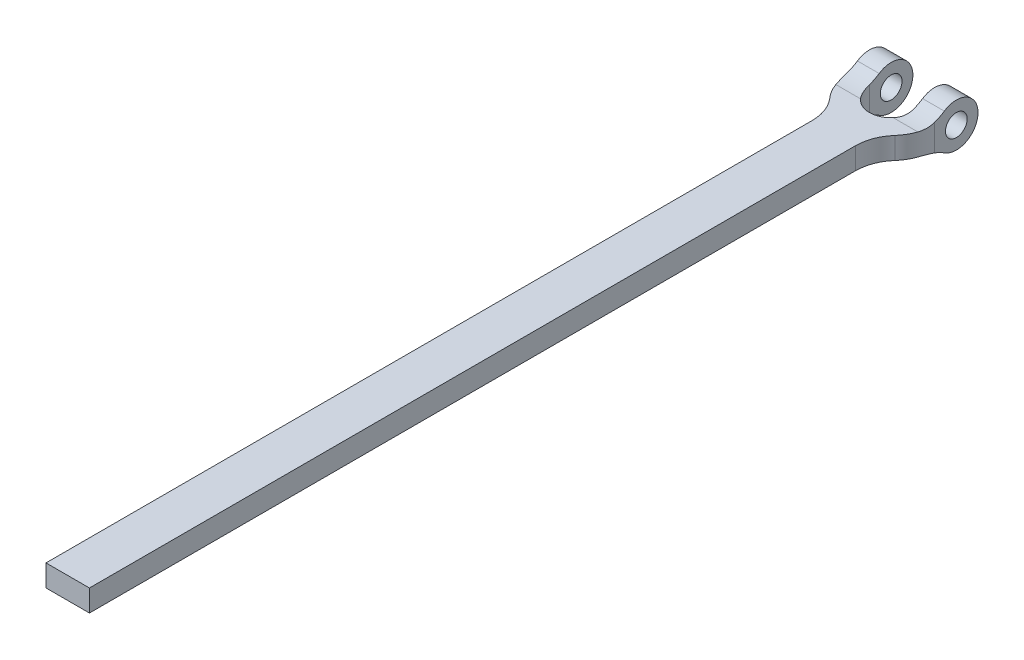
ISO-10303-21;
HEADER;
FILE_DESCRIPTION(('STEP AP214'),'2;1');
FILE_NAME('part.step','',(''),(''),'','','');
FILE_SCHEMA(('AUTOMOTIVE_DESIGN { 1 0 10303 214 1 1 1 1 }'));
ENDSEC;
DATA;
#1=APPLICATION_CONTEXT('core data for automotive mechanical design processes');
#2=APPLICATION_PROTOCOL_DEFINITION('international standard','automotive_design',2000,#1);
#3=PRODUCT_CONTEXT('',#1,'mechanical');
#4=PRODUCT('Part','Part','',(#3));
#5=PRODUCT_RELATED_PRODUCT_CATEGORY('part','',(#4));
#6=PRODUCT_DEFINITION_FORMATION('','',#4);
#7=PRODUCT_DEFINITION_CONTEXT('part definition',#1,'design');
#8=PRODUCT_DEFINITION('design','',#6,#7);
#9=PRODUCT_DEFINITION_SHAPE('','',#8);
#10=(LENGTH_UNIT() NAMED_UNIT(*) SI_UNIT(.MILLI.,.METRE.));
#11=(NAMED_UNIT(*) PLANE_ANGLE_UNIT() SI_UNIT($,.RADIAN.));
#12=(NAMED_UNIT(*) SI_UNIT($,.STERADIAN.) SOLID_ANGLE_UNIT());
#13=UNCERTAINTY_MEASURE_WITH_UNIT(LENGTH_MEASURE(1.E-05),#10,'distance_accuracy_value','');
#14=(GEOMETRIC_REPRESENTATION_CONTEXT(3) GLOBAL_UNCERTAINTY_ASSIGNED_CONTEXT((#13)) GLOBAL_UNIT_ASSIGNED_CONTEXT((#10,
#11,#12)) REPRESENTATION_CONTEXT('',''));
#15=CARTESIAN_POINT('',(0.,0.,0.));
#16=DIRECTION('',(0.,0.,1.));
#17=DIRECTION('',(1.,0.,0.));
#18=AXIS2_PLACEMENT_3D('',#15,#16,#17);
#19=CARTESIAN_POINT('',(10.,10.,0.));
#20=DIRECTION('',(-1.,0.,0.));
#21=DIRECTION('',(0.,0.,1.));
#22=AXIS2_PLACEMENT_3D('',#19,#20,#21);
#23=PLANE('',#22);
#24=CARTESIAN_POINT('',(10.,5.,-94.9999999999994));
#25=DIRECTION('',(-1.,0.,0.));
#26=DIRECTION('',(0.,0.,1.));
#27=AXIS2_PLACEMENT_3D('',#24,#25,#26);
#28=CIRCLE('',#27,2.5);
#29=CARTESIAN_POINT('',(10.,5.,-92.4999999999994));
#30=VERTEX_POINT('',#29);
#31=EDGE_CURVE('E221',#30,#30,#28,.T.);
#32=ORIENTED_EDGE('',*,*,#31,.T.);
#33=EDGE_LOOP('',(#32));
#34=FACE_BOUND('',#33,.T.);
#35=CARTESIAN_POINT('',(10.,-7.49999999999999,-86.7112663055884));
#36=DIRECTION('',(-1.,0.,0.));
#37=DIRECTION('',(0.,0.,1.));
#38=AXIS2_PLACEMENT_3D('',#35,#36,#37);
#39=CIRCLE('',#38,10.);
#40=CARTESIAN_POINT('',(10.,0.834201871749733,-92.23766469522));
#41=VERTEX_POINT('',#40);
#42=CARTESIAN_POINT('',(10.,1.94374029117922,-90.));
#43=VERTEX_POINT('',#42);
#44=EDGE_CURVE('E196',#41,#43,#39,.F.);
#45=ORIENTED_EDGE('',*,*,#44,.F.);
#46=CARTESIAN_POINT('',(10.,5.,-94.9999999999994));
#47=DIRECTION('',(-1.,0.,0.));
#48=DIRECTION('',(0.,0.,1.));
#49=AXIS2_PLACEMENT_3D('',#46,#47,#48);
#50=CIRCLE('',#49,4.99843679377504);
#51=CARTESIAN_POINT('',(10.,9.16579812825027,-92.23766469522));
#52=VERTEX_POINT('',#51);
#53=EDGE_CURVE('E185',#52,#41,#50,.T.);
#54=ORIENTED_EDGE('',*,*,#53,.F.);
#55=CARTESIAN_POINT('',(10.,17.5,-86.7112663055884));
#56=DIRECTION('',(-1.,0.,0.));
#57=DIRECTION('',(0.,0.,1.));
#58=AXIS2_PLACEMENT_3D('',#55,#56,#57);
#59=CIRCLE('',#58,10.);
#60=CARTESIAN_POINT('',(10.,8.05625970882078,-90.));
#61=VERTEX_POINT('',#60);
#62=EDGE_CURVE('E195',#61,#52,#59,.F.);
#63=ORIENTED_EDGE('',*,*,#62,.F.);
#64=DIRECTION('',(0.,-1.,0.));
#65=VECTOR('',#64,1.);
#66=CARTESIAN_POINT('',(10.,10.,-90.));
#67=LINE('',#66,#65);
#68=EDGE_CURVE('E207',#61,#43,#67,.T.);
#69=ORIENTED_EDGE('',*,*,#68,.T.);
#70=EDGE_LOOP('',(#45,#54,#63,#69));
#71=FACE_BOUND('',#70,.T.);
#72=ADVANCED_FACE('F54',(#34,#71),#23,.F.);
#73=CARTESIAN_POINT('',(0.,10.,-90.));
#74=DIRECTION('',(0.,-1.,0.));
#75=DIRECTION('',(0.,0.,-1.));
#76=AXIS2_PLACEMENT_3D('',#73,#74,#75);
#77=CYLINDRICAL_SURFACE('',#76,10.);
#78=CARTESIAN_POINT('',(10.,1.94374029117922,-90.));
#79=CARTESIAN_POINT('',(10.0000398780897,2.01162167291497,-89.8052045160382));
#80=CARTESIAN_POINT('',(9.99430949334773,2.07340612183781,-89.6082556898361));
#81=CARTESIAN_POINT('',(9.97083551837577,2.18457972319173,-89.2114966672872));
#82=CARTESIAN_POINT('',(9.95308619963056,2.23396294950643,-89.0116851509854));
#83=CARTESIAN_POINT('',(9.90556967424014,2.31922604173671,-88.6147520612777));
#84=CARTESIAN_POINT('',(9.87604413321497,2.35535096211938,-88.4176542405833));
#85=CARTESIAN_POINT('',(9.80484894299264,2.41547181746806,-88.0239124303129));
#86=CARTESIAN_POINT('',(9.7631862839542,2.43947471220987,-87.8272682449955));
#87=CARTESIAN_POINT('',(9.67783588916147,2.47183391295842,-87.4771529237916));
#88=CARTESIAN_POINT('',(9.63642826391808,2.48242244076037,-87.3233229213572));
#89=CARTESIAN_POINT('',(9.54586266927498,2.49653957518559,-87.0163133856331));
#90=CARTESIAN_POINT('',(9.49664633385394,2.50001203009499,-86.8631484713804));
#91=CARTESIAN_POINT('',(9.44374029117924,2.50000000000002,-86.7112663055884));
#92=B_SPLINE_CURVE_WITH_KNOTS('',3,(#78,#79,#80,#81,#82,#83,#84,#85,#86,#87,#88,#89,#90,#91),
.UNSPECIFIED.,.F.,.F.,(4,2,2,2,2,2,4),(0.,0.618714433674671,1.23772396940433,1.84463517623932,
2.45119753199543,2.92983847631207,3.41224197417205),.UNSPECIFIED.);
#93=CARTESIAN_POINT('',(9.44374029117922,2.5,-86.7112663055884));
#94=VERTEX_POINT('',#93);
#95=EDGE_CURVE('E333',#43,#94,#92,.T.);
#96=ORIENTED_EDGE('',*,*,#95,.F.);
#97=ORIENTED_EDGE('',*,*,#68,.F.);
#98=CARTESIAN_POINT('',(9.44374029117922,7.5,-86.7112663055884));
#99=CARTESIAN_POINT('',(9.51162167291498,7.49996012191029,-86.9060617895502));
#100=CARTESIAN_POINT('',(9.57340612183781,7.50569050665228,-87.1030106157523));
#101=CARTESIAN_POINT('',(9.68457972319174,7.52916448162423,-87.4997696383012));
#102=CARTESIAN_POINT('',(9.73396294950644,7.54691380036944,-87.699581154603));
#103=CARTESIAN_POINT('',(9.81922604173672,7.59443032575986,-88.0965142443107));
#104=CARTESIAN_POINT('',(9.85535096211938,7.62395586678503,-88.2936120650052));
#105=CARTESIAN_POINT('',(9.91547181746807,7.69515105700736,-88.6873538752756));
#106=CARTESIAN_POINT('',(9.93947471220988,7.73681371604581,-88.8839980605929));
#107=CARTESIAN_POINT('',(9.97183391295843,7.82216411083854,-89.2341133817968));
#108=CARTESIAN_POINT('',(9.98242244076038,7.86357173608192,-89.3879433842312));
#109=CARTESIAN_POINT('',(9.99653957518559,7.95413733072503,-89.6949529199553));
#110=CARTESIAN_POINT('',(10.000012030095,8.00335366614606,-89.8481178342081));
#111=CARTESIAN_POINT('',(10.,8.05625970882077,-90.));
#112=B_SPLINE_CURVE_WITH_KNOTS('',3,(#98,#99,#100,#101,#102,#103,#104,#105,#106,#107,#108,#109,
#110,#111),.UNSPECIFIED.,.F.,.F.,(4,2,2,2,2,2,4),(0.,0.618714433674671,1.23772396940433,
1.84463517623932,2.45119753199543,2.92983847631207,3.41224197417205),.UNSPECIFIED.);
#113=CARTESIAN_POINT('',(9.44374029117922,7.5,-86.7112663055884));
#114=VERTEX_POINT('',#113);
#115=EDGE_CURVE('E309',#114,#61,#112,.T.);
#116=ORIENTED_EDGE('',*,*,#115,.F.);
#117=CARTESIAN_POINT('',(0.,7.5,-90.));
#118=DIRECTION('',(0.,-1.,0.));
#119=DIRECTION('',(0.,0.,-1.));
#120=AXIS2_PLACEMENT_3D('',#117,#118,#119);
#121=CIRCLE('',#120,10.);
#122=CARTESIAN_POINT('',(7.50000000000001,7.5,-83.3856217223385));
#123=VERTEX_POINT('',#122);
#124=EDGE_CURVE('E241',#114,#123,#121,.T.);
#125=ORIENTED_EDGE('',*,*,#124,.T.);
#126=DIRECTION('',(0.,-1.,0.));
#127=VECTOR('',#126,1.);
#128=CARTESIAN_POINT('',(7.50000000000001,10.,-83.3856217223385));
#129=LINE('',#128,#127);
#130=CARTESIAN_POINT('',(7.50000000000001,2.5,-83.3856217223385));
#131=VERTEX_POINT('',#130);
#132=EDGE_CURVE('E386',#123,#131,#129,.T.);
#133=ORIENTED_EDGE('',*,*,#132,.T.);
#134=CARTESIAN_POINT('',(0.,2.5,-90.));
#135=DIRECTION('',(0.,-1.,0.));
#136=DIRECTION('',(0.,0.,-1.));
#137=AXIS2_PLACEMENT_3D('',#134,#135,#136);
#138=CIRCLE('',#137,10.);
#139=EDGE_CURVE('E258',#94,#131,#138,.T.);
#140=ORIENTED_EDGE('',*,*,#139,.F.);
#141=EDGE_LOOP('',(#96,#97,#116,#125,#133,#140));
#142=FACE_BOUND('',#141,.T.);
#143=ADVANCED_FACE('F318',(#142),#77,.T.);
#144=CARTESIAN_POINT('',(5.00000000000001,10.,0.));
#145=DIRECTION('',(1.,0.,0.));
#146=DIRECTION('',(0.,0.,-1.));
#147=AXIS2_PLACEMENT_3D('',#144,#145,#146);
#148=PLANE('',#147);
#149=DIRECTION('',(0.,1.,0.));
#150=VECTOR('',#149,1.);
#151=CARTESIAN_POINT('',(5.00000000000001,10.,99.5575348648209));
#152=LINE('',#151,#150);
#153=CARTESIAN_POINT('',(5.00000000000001,2.5,99.5575348648209));
#154=VERTEX_POINT('',#153);
#155=CARTESIAN_POINT('',(5.00000000000001,7.5,99.5575348648209));
#156=VERTEX_POINT('',#155);
#157=EDGE_CURVE('E391',#154,#156,#152,.T.);
#158=ORIENTED_EDGE('',*,*,#157,.F.);
#159=DIRECTION('',(0.,0.,-1.));
#160=VECTOR('',#159,1.);
#161=CARTESIAN_POINT('',(5.00000000000001,2.5,0.));
#162=LINE('',#161,#160);
#163=CARTESIAN_POINT('',(5.00000000000001,2.5,-76.7712434446771));
#164=VERTEX_POINT('',#163);
#165=EDGE_CURVE('E393',#154,#164,#162,.T.);
#166=ORIENTED_EDGE('',*,*,#165,.T.);
#167=DIRECTION('',(0.,-1.,0.));
#168=VECTOR('',#167,1.);
#169=CARTESIAN_POINT('',(5.00000000000001,10.,-76.7712434446771));
#170=LINE('',#169,#168);
#171=CARTESIAN_POINT('',(5.00000000000001,7.5,-76.7712434446771));
#172=VERTEX_POINT('',#171);
#173=EDGE_CURVE('E414',#172,#164,#170,.T.);
#174=ORIENTED_EDGE('',*,*,#173,.F.);
#175=DIRECTION('',(0.,0.,-1.));
#176=VECTOR('',#175,1.);
#177=CARTESIAN_POINT('',(5.00000000000001,7.5,0.));
#178=LINE('',#177,#176);
#179=EDGE_CURVE('E389',#156,#172,#178,.T.);
#180=ORIENTED_EDGE('',*,*,#179,.F.);
#181=EDGE_LOOP('',(#158,#166,#174,#180));
#182=FACE_BOUND('',#181,.T.);
#183=ADVANCED_FACE('F323',(#182),#148,.T.);
#184=CARTESIAN_POINT('',(15.,10.,-76.7712434446771));
#185=DIRECTION('',(0.,-1.,0.));
#186=DIRECTION('',(0.,0.,-1.));
#187=AXIS2_PLACEMENT_3D('',#184,#185,#186);
#188=CYLINDRICAL_SURFACE('',#187,10.);
#189=ORIENTED_EDGE('',*,*,#173,.T.);
#190=CARTESIAN_POINT('',(15.,2.5,-76.7712434446771));
#191=DIRECTION('',(0.,-1.,0.));
#192=DIRECTION('',(0.,0.,-1.));
#193=AXIS2_PLACEMENT_3D('',#190,#191,#192);
#194=CIRCLE('',#193,10.);
#195=EDGE_CURVE('E255',#164,#131,#194,.T.);
#196=ORIENTED_EDGE('',*,*,#195,.T.);
#197=ORIENTED_EDGE('',*,*,#132,.F.);
#198=CARTESIAN_POINT('',(15.,7.5,-76.7712434446771));
#199=DIRECTION('',(0.,-1.,0.));
#200=DIRECTION('',(0.,0.,-1.));
#201=AXIS2_PLACEMENT_3D('',#198,#199,#200);
#202=CIRCLE('',#201,10.);
#203=EDGE_CURVE('E239',#172,#123,#202,.T.);
#204=ORIENTED_EDGE('',*,*,#203,.F.);
#205=EDGE_LOOP('',(#189,#196,#197,#204));
#206=FACE_BOUND('',#205,.T.);
#207=ADVANCED_FACE('F56',(#206),#188,.F.);
#208=CARTESIAN_POINT('',(10.,5.,-94.9999999999994));
#209=DIRECTION('',(-1.,0.,0.));
#210=DIRECTION('',(0.,0.,1.));
#211=AXIS2_PLACEMENT_3D('',#208,#209,#210);
#212=CYLINDRICAL_SURFACE('',#211,4.99843679377504);
#213=CARTESIAN_POINT('',(-5.,5.,-94.9999999999994));
#214=DIRECTION('',(-1.,0.,0.));
#215=DIRECTION('',(0.,0.,1.));
#216=AXIS2_PLACEMENT_3D('',#213,#214,#215);
#217=CIRCLE('',#216,4.99843679377504);
#218=CARTESIAN_POINT('',(-5.,9.16579812825027,-92.23766469522));
#219=VERTEX_POINT('',#218);
#220=CARTESIAN_POINT('',(-5.,0.834201871749733,-92.23766469522));
#221=VERTEX_POINT('',#220);
#222=EDGE_CURVE('E340',#219,#221,#217,.T.);
#223=ORIENTED_EDGE('',*,*,#222,.T.);
#224=DIRECTION('',(-1.,0.,0.));
#225=VECTOR('',#224,1.);
#226=CARTESIAN_POINT('',(10.,0.834201871749733,-92.23766469522));
#227=LINE('',#226,#225);
#228=CARTESIAN_POINT('',(-9.99999999999999,0.834201871749733,-92.23766469522));
#229=VERTEX_POINT('',#228);
#230=EDGE_CURVE('E203',#221,#229,#227,.T.);
#231=ORIENTED_EDGE('',*,*,#230,.T.);
#232=CARTESIAN_POINT('',(-9.99999999999999,5.,-94.9999999999994));
#233=DIRECTION('',(-1.,0.,0.));
#234=DIRECTION('',(0.,0.,1.));
#235=AXIS2_PLACEMENT_3D('',#232,#233,#234);
#236=CIRCLE('',#235,4.99843679377504);
#237=CARTESIAN_POINT('',(-9.99999999999999,9.16579812825027,-92.23766469522));
#238=VERTEX_POINT('',#237);
#239=EDGE_CURVE('E211',#238,#229,#236,.T.);
#240=ORIENTED_EDGE('',*,*,#239,.F.);
#241=DIRECTION('',(-1.,0.,0.));
#242=VECTOR('',#241,1.);
#243=CARTESIAN_POINT('',(10.,9.16579812825027,-92.23766469522));
#244=LINE('',#243,#242);
#245=EDGE_CURVE('E75',#219,#238,#244,.T.);
#246=ORIENTED_EDGE('',*,*,#245,.F.);
#247=EDGE_LOOP('',(#223,#231,#240,#246));
#248=FACE_BOUND('',#247,.T.);
#249=ADVANCED_FACE('F346',(#248),#212,.T.);
#250=CARTESIAN_POINT('',(10.,-7.49999999999999,-86.7112663055884));
#251=DIRECTION('',(-1.,0.,0.));
#252=DIRECTION('',(0.,0.,1.));
#253=AXIS2_PLACEMENT_3D('',#250,#251,#252);
#254=CYLINDRICAL_SURFACE('',#253,10.);
#255=ORIENTED_EDGE('',*,*,#95,.T.);
#256=DIRECTION('',(-1.,0.,0.));
#257=VECTOR('',#256,1.);
#258=CARTESIAN_POINT('',(10.,2.5,-86.7112663055884));
#259=LINE('',#258,#257);
#260=CARTESIAN_POINT('',(3.76619578450745,2.5,-86.7112663055884));
#261=VERTEX_POINT('',#260);
#262=EDGE_CURVE('E227',#94,#261,#259,.T.);
#263=ORIENTED_EDGE('',*,*,#262,.T.);
#264=CARTESIAN_POINT('',(5.00000000000001,1.94374029117922,-90.));
#265=CARTESIAN_POINT('',(5.00001875762441,1.98668349224835,-89.8767522203771));
#266=CARTESIAN_POINT('',(4.9954432397168,2.02718070336891,-89.7526302240834));
#267=CARTESIAN_POINT('',(4.97685272406057,2.10313322547448,-89.5035195259979));
#268=CARTESIAN_POINT('',(4.96283516820384,2.1385871669452,-89.3785305984153));
#269=CARTESIAN_POINT('',(4.92511512970301,2.20426974348087,-89.1286737353402));
#270=CARTESIAN_POINT('',(4.90141560682612,2.23449997141437,-89.0038057745513));
#271=CARTESIAN_POINT('',(4.84424106558613,2.28972176642235,-88.755173023913));
#272=CARTESIAN_POINT('',(4.81076754807694,2.31471413678906,-88.6314080676954));
#273=CARTESIAN_POINT('',(4.73399247590601,2.35960722867947,-88.3857147699631));
#274=CARTESIAN_POINT('',(4.69066964293294,2.37949672504427,-88.2637910234605));
#275=CARTESIAN_POINT('',(4.59440588222191,2.41433061357727,-88.0230738467284));
#276=CARTESIAN_POINT('',(4.54146488381222,2.42927496940761,-87.904280439507));
#277=CARTESIAN_POINT('',(4.42635223236165,2.4545307980139,-87.6709872288966));
#278=CARTESIAN_POINT('',(4.36419543850701,2.46484962300434,-87.5564808787528));
#279=CARTESIAN_POINT('',(4.23100642691316,2.48131607785379,-87.3325011307518));
#280=CARTESIAN_POINT('',(4.15997829722629,2.48746562064738,-87.2230254462663));
#281=CARTESIAN_POINT('',(4.03517153654814,2.49463601289015,-87.0462249260312));
#282=CARTESIAN_POINT('',(3.98376515698393,2.49669052500043,-86.9772514953533));
#283=CARTESIAN_POINT('',(3.87752603991081,2.4993719507438,-86.8421255002647));
#284=CARTESIAN_POINT('',(3.82269828508097,2.50000089283435,-86.7759690593138));
#285=CARTESIAN_POINT('',(3.76619578450745,2.5,-86.7112663055884));
#286=B_SPLINE_CURVE_WITH_KNOTS('',3,(#264,#265,#266,#267,#268,#269,#270,#271,#272,#273,#274,
#275,#276,#277,#278,#279,#280,#281,#282,#283,#284,#285),.UNSPECIFIED.,.F.,.F.,(4,2,2,2,2,2,2,2,
2,2,4),(0.,0.39146947165287,0.783045045848592,1.17450100526712,1.56589688592123,
1.95814650560357,2.35039900754883,2.74202579961326,3.13347278510712,3.39149775702121,
3.64915535158868),.UNSPECIFIED.);
#287=CARTESIAN_POINT('',(5.00000000000001,1.94374029117922,-90.));
#288=VERTEX_POINT('',#287);
#289=EDGE_CURVE('E355',#288,#261,#286,.T.);
#290=ORIENTED_EDGE('',*,*,#289,.F.);
#291=CARTESIAN_POINT('',(5.00000000000001,-7.49999999999999,-86.7112663055884));
#292=DIRECTION('',(-1.,0.,0.));
#293=DIRECTION('',(0.,0.,1.));
#294=AXIS2_PLACEMENT_3D('',#291,#292,#293);
#295=CIRCLE('',#294,10.);
#296=CARTESIAN_POINT('',(5.00000000000001,0.834201871749733,-92.23766469522));
#297=VERTEX_POINT('',#296);
#298=EDGE_CURVE('E202',#297,#288,#295,.F.);
#299=ORIENTED_EDGE('',*,*,#298,.F.);
#300=EDGE_CURVE('E188',#41,#297,#227,.T.);
#301=ORIENTED_EDGE('',*,*,#300,.F.);
#302=ORIENTED_EDGE('',*,*,#44,.T.);
#303=EDGE_LOOP('',(#255,#263,#290,#299,#301,#302));
#304=FACE_BOUND('',#303,.T.);
#305=ADVANCED_FACE('F199',(#304),#254,.F.);
#306=CARTESIAN_POINT('',(-3.76619578450744,2.5,-86.7112663055884));
#307=VERTEX_POINT('',#306);
#308=CARTESIAN_POINT('',(-9.44374029117921,2.5,-86.7112663055884));
#309=VERTEX_POINT('',#308);
#310=EDGE_CURVE('E224',#307,#309,#259,.T.);
#311=ORIENTED_EDGE('',*,*,#310,.T.);
#312=CARTESIAN_POINT('',(-9.44374029117921,2.5,-86.7112663055884));
#313=CARTESIAN_POINT('',(-9.51162167291497,2.50003987808971,-86.9060617895502));
#314=CARTESIAN_POINT('',(-9.5734061218378,2.49430949334772,-87.1030106157523));
#315=CARTESIAN_POINT('',(-9.68457972319173,2.47083551837577,-87.4997696383012));
#316=CARTESIAN_POINT('',(-9.73396294950643,2.45308619963056,-87.699581154603));
#317=CARTESIAN_POINT('',(-9.81922604173671,2.40556967424014,-88.0965142443107));
#318=CARTESIAN_POINT('',(-9.85535096211937,2.37604413321497,-88.2936120650052));
#319=CARTESIAN_POINT('',(-9.91547181746806,2.30484894299264,-88.6873538752756));
#320=CARTESIAN_POINT('',(-9.93947471220987,2.26318628395419,-88.8839980605929));
#321=CARTESIAN_POINT('',(-9.97183391295841,2.17783588916146,-89.2341133817968));
#322=CARTESIAN_POINT('',(-9.98242244076036,2.13642826391807,-89.3879433842312));
#323=CARTESIAN_POINT('',(-9.99653957518558,2.04586266927497,-89.6949529199553));
#324=CARTESIAN_POINT('',(-10.000012030095,1.99664633385394,-89.8481178342081));
#325=CARTESIAN_POINT('',(-10.,1.94374029117923,-90.));
#326=B_SPLINE_CURVE_WITH_KNOTS('',3,(#312,#313,#314,#315,#316,#317,#318,#319,#320,#321,#322,
#323,#324,#325),.UNSPECIFIED.,.F.,.F.,(4,2,2,2,2,2,4),(0.,0.618714433674671,1.23772396940433,
1.84463517623932,2.45119753199543,2.92983847631207,3.41224197417205),.UNSPECIFIED.);
#327=CARTESIAN_POINT('',(-9.99999999999999,1.94374029117922,-90.));
#328=VERTEX_POINT('',#327);
#329=EDGE_CURVE('E12',#309,#328,#326,.T.);
#330=ORIENTED_EDGE('',*,*,#329,.T.);
#331=CARTESIAN_POINT('',(-9.99999999999999,-7.49999999999999,-86.7112663055884));
#332=DIRECTION('',(-1.,0.,0.));
#333=DIRECTION('',(0.,0.,1.));
#334=AXIS2_PLACEMENT_3D('',#331,#332,#333);
#335=CIRCLE('',#334,10.);
#336=EDGE_CURVE('E218',#229,#328,#335,.F.);
#337=ORIENTED_EDGE('',*,*,#336,.F.);
#338=ORIENTED_EDGE('',*,*,#230,.F.);
#339=CARTESIAN_POINT('',(-5.,-7.49999999999999,-86.7112663055884));
#340=DIRECTION('',(-1.,0.,0.));
#341=DIRECTION('',(0.,0.,1.));
#342=AXIS2_PLACEMENT_3D('',#339,#340,#341);
#343=CIRCLE('',#342,10.);
#344=CARTESIAN_POINT('',(-5.,1.94374029117922,-90.));
#345=VERTEX_POINT('',#344);
#346=EDGE_CURVE('E315',#221,#345,#343,.F.);
#347=ORIENTED_EDGE('',*,*,#346,.T.);
#348=CARTESIAN_POINT('',(-3.76619578450744,2.5,-86.7112663055884));
#349=CARTESIAN_POINT('',(-3.85204645443358,2.50000883669405,-86.809554046744));
#350=CARTESIAN_POINT('',(-3.9340307511943,2.4985514388465,-86.9112345317816));
#351=CARTESIAN_POINT('',(-4.08977590988513,2.49216397977471,-87.1206395776584));
#352=CARTESIAN_POINT('',(-4.16353494254257,2.48723314784671,-87.2283654750022));
#353=CARTESIAN_POINT('',(-4.30229171394781,2.47335900399682,-87.4490619308684));
#354=CARTESIAN_POINT('',(-4.36729053867508,2.46441619002566,-87.5620318369665));
#355=CARTESIAN_POINT('',(-4.4881095096358,2.4420653989356,-87.792336883464));
#356=CARTESIAN_POINT('',(-4.54393087237672,2.42865801432646,-87.9096714427794));
#357=CARTESIAN_POINT('',(-4.64618607588933,2.39697960734359,-88.148025860284));
#358=CARTESIAN_POINT('',(-4.69259984678367,2.37869837554981,-88.2690529766046));
#359=CARTESIAN_POINT('',(-4.77568137561426,2.33702972518521,-88.5135488985573));
#360=CARTESIAN_POINT('',(-4.81234915852437,2.31364231969913,-88.6370176979318));
#361=CARTESIAN_POINT('',(-4.87580885381042,2.26167109583347,-88.8851618153611));
#362=CARTESIAN_POINT('',(-4.90261679419414,2.2330958247485,-89.0098348341667));
#363=CARTESIAN_POINT('',(-4.94649048201646,2.17072295441886,-89.2595335275235));
#364=CARTESIAN_POINT('',(-4.96356057754268,2.13692769455375,-89.3845590195896));
#365=CARTESIAN_POINT('',(-4.9839743608624,2.07660417375264,-89.5915439688647));
#366=CARTESIAN_POINT('',(-4.99001275075594,2.05151951636651,-89.6736724964353));
#367=CARTESIAN_POINT('',(-4.99802372133299,1.99921919137265,-89.8373208944297));
#368=CARTESIAN_POINT('',(-5.00000201524402,1.97200657424986,-89.9188414590761));
#369=CARTESIAN_POINT('',(-5.,1.94374029117921,-90.));
#370=B_SPLINE_CURVE_WITH_KNOTS('',3,(#348,#349,#350,#351,#352,#353,#354,#355,#356,#357,#358,
#359,#360,#361,#362,#363,#364,#365,#366,#367,#368,#369),.UNSPECIFIED.,.F.,.F.,(4,2,2,2,2,2,2,2,
2,2,4),(0.,0.391416255928357,0.782919388714228,1.17437394317783,1.56577656694351,1.958005606802,
2.35023364157305,2.74182122855859,3.13323382892684,3.39137576286657,3.64915419859571),.UNSPECIFIED.);
#371=EDGE_CURVE('E350',#307,#345,#370,.T.);
#372=ORIENTED_EDGE('',*,*,#371,.F.);
#373=EDGE_LOOP('',(#311,#330,#337,#338,#347,#372));
#374=FACE_BOUND('',#373,.T.);
#375=ADVANCED_FACE('F296',(#374),#254,.F.);
#376=CARTESIAN_POINT('',(10.,17.5,-86.7112663055884));
#377=DIRECTION('',(-1.,0.,0.));
#378=DIRECTION('',(0.,0.,1.));
#379=AXIS2_PLACEMENT_3D('',#376,#377,#378);
#380=CYLINDRICAL_SURFACE('',#379,10.);
#381=ORIENTED_EDGE('',*,*,#115,.T.);
#382=ORIENTED_EDGE('',*,*,#62,.T.);
#383=CARTESIAN_POINT('',(5.00000000000001,9.16579812825027,-92.23766469522));
#384=VERTEX_POINT('',#383);
#385=EDGE_CURVE('E191',#52,#384,#244,.T.);
#386=ORIENTED_EDGE('',*,*,#385,.T.);
#387=CARTESIAN_POINT('',(5.00000000000001,17.5,-86.7112663055884));
#388=DIRECTION('',(-1.,0.,0.));
#389=DIRECTION('',(0.,0.,1.));
#390=AXIS2_PLACEMENT_3D('',#387,#388,#389);
#391=CIRCLE('',#390,10.);
#392=CARTESIAN_POINT('',(5.00000000000001,8.05625970882078,-90.));
#393=VERTEX_POINT('',#392);
#394=EDGE_CURVE('E316',#393,#384,#391,.F.);
#395=ORIENTED_EDGE('',*,*,#394,.F.);
#396=CARTESIAN_POINT('',(3.76619578450745,7.5,-86.7112663055884));
#397=CARTESIAN_POINT('',(3.85204645443359,7.49999116330595,-86.809554046744));
#398=CARTESIAN_POINT('',(3.93403075119431,7.5014485611535,-86.9112345317816));
#399=CARTESIAN_POINT('',(4.08977590988514,7.50783602022529,-87.1206395776584));
#400=CARTESIAN_POINT('',(4.16353494254258,7.51276685215329,-87.2283654750022));
#401=CARTESIAN_POINT('',(4.30229171394782,7.52664099600318,-87.4490619308684));
#402=CARTESIAN_POINT('',(4.36729053867509,7.53558380997434,-87.5620318369665));
#403=CARTESIAN_POINT('',(4.48810950963581,7.5579346010644,-87.792336883464));
#404=CARTESIAN_POINT('',(4.54393087237673,7.57134198567354,-87.9096714427794));
#405=CARTESIAN_POINT('',(4.64618607588934,7.60302039265641,-88.148025860284));
#406=CARTESIAN_POINT('',(4.69259984678368,7.62130162445019,-88.2690529766046));
#407=CARTESIAN_POINT('',(4.77568137561427,7.66297027481479,-88.5135488985573));
#408=CARTESIAN_POINT('',(4.81234915852438,7.68635768030087,-88.6370176979318));
#409=CARTESIAN_POINT('',(4.87580885381042,7.73832890416652,-88.8851618153611));
#410=CARTESIAN_POINT('',(4.90261679419414,7.7669041752515,-89.0098348341667));
#411=CARTESIAN_POINT('',(4.94649048201647,7.82927704558114,-89.2595335275235));
#412=CARTESIAN_POINT('',(4.96356057754268,7.86307230544625,-89.3845590195896));
#413=CARTESIAN_POINT('',(4.98397436086241,7.92339582624736,-89.5915439688647));
#414=CARTESIAN_POINT('',(4.99001275075595,7.94848048363348,-89.6736724964353));
#415=CARTESIAN_POINT('',(4.998023721333,8.00078080862735,-89.8373208944297));
#416=CARTESIAN_POINT('',(5.00000201524403,8.02799342575014,-89.9188414590761));
#417=CARTESIAN_POINT('',(5.00000000000001,8.05625970882078,-90.));
#418=B_SPLINE_CURVE_WITH_KNOTS('',3,(#396,#397,#398,#399,#400,#401,#402,#403,#404,#405,#406,
#407,#408,#409,#410,#411,#412,#413,#414,#415,#416,#417),.UNSPECIFIED.,.F.,.F.,(4,2,2,2,2,2,2,2,
2,2,4),(0.,0.391416255928357,0.782919388714228,1.17437394317783,1.56577656694351,1.958005606802,
2.35023364157305,2.74182122855856,3.13323382892684,3.39137576286656,3.64915419859571),.UNSPECIFIED.);
#419=CARTESIAN_POINT('',(3.76619578450745,7.5,-86.7112663055884));
#420=VERTEX_POINT('',#419);
#421=EDGE_CURVE('E280',#420,#393,#418,.T.);
#422=ORIENTED_EDGE('',*,*,#421,.F.);
#423=DIRECTION('',(-1.,0.,0.));
#424=VECTOR('',#423,1.);
#425=CARTESIAN_POINT('',(10.,7.5,-86.7112663055884));
#426=LINE('',#425,#424);
#427=EDGE_CURVE('E234',#114,#420,#426,.T.);
#428=ORIENTED_EDGE('',*,*,#427,.F.);
#429=EDGE_LOOP('',(#381,#382,#386,#395,#422,#428));
#430=FACE_BOUND('',#429,.T.);
#431=ADVANCED_FACE('F290',(#430),#380,.F.);
#432=CARTESIAN_POINT('',(-5.,17.5,-86.7112663055884));
#433=DIRECTION('',(-1.,0.,0.));
#434=DIRECTION('',(0.,0.,1.));
#435=AXIS2_PLACEMENT_3D('',#432,#433,#434);
#436=CIRCLE('',#435,10.);
#437=CARTESIAN_POINT('',(-5.,8.05625970882078,-90.));
#438=VERTEX_POINT('',#437);
#439=EDGE_CURVE('E269',#438,#219,#436,.F.);
#440=ORIENTED_EDGE('',*,*,#439,.T.);
#441=ORIENTED_EDGE('',*,*,#245,.T.);
#442=CARTESIAN_POINT('',(-9.99999999999999,17.5,-86.7112663055884));
#443=DIRECTION('',(-1.,0.,0.));
#444=DIRECTION('',(0.,0.,1.));
#445=AXIS2_PLACEMENT_3D('',#442,#443,#444);
#446=CIRCLE('',#445,10.);
#447=CARTESIAN_POINT('',(-9.99999999999999,8.05625970882078,-90.));
#448=VERTEX_POINT('',#447);
#449=EDGE_CURVE('E208',#448,#238,#446,.F.);
#450=ORIENTED_EDGE('',*,*,#449,.F.);
#451=CARTESIAN_POINT('',(-10.,8.05625970882078,-90.));
#452=CARTESIAN_POINT('',(-10.0000398780897,7.98837832708502,-89.8052045160382));
#453=CARTESIAN_POINT('',(-9.99430949334772,7.92659387816219,-89.6082556898361));
#454=CARTESIAN_POINT('',(-9.97083551837576,7.81542027680827,-89.2114966672872));
#455=CARTESIAN_POINT('',(-9.95308619963055,7.76603705049357,-89.0116851509854));
#456=CARTESIAN_POINT('',(-9.90556967424013,7.68077395826329,-88.6147520612777));
#457=CARTESIAN_POINT('',(-9.87604413321497,7.64464903788062,-88.4176542405833));
#458=CARTESIAN_POINT('',(-9.80484894299263,7.58452818253194,-88.0239124303129));
#459=CARTESIAN_POINT('',(-9.76318628395419,7.56052528779013,-87.8272682449955));
#460=CARTESIAN_POINT('',(-9.67783588916146,7.52816608704158,-87.4771529237916));
#461=CARTESIAN_POINT('',(-9.63642826391807,7.51757755923963,-87.3233229213572));
#462=CARTESIAN_POINT('',(-9.54586266927497,7.50346042481441,-87.0163133856331));
#463=CARTESIAN_POINT('',(-9.49664633385393,7.49998796990501,-86.8631484713804));
#464=CARTESIAN_POINT('',(-9.44374029117923,7.49999999999998,-86.7112663055884));
#465=B_SPLINE_CURVE_WITH_KNOTS('',3,(#451,#452,#453,#454,#455,#456,#457,#458,#459,#460,#461,
#462,#463,#464),.UNSPECIFIED.,.F.,.F.,(4,2,2,2,2,2,4),(0.,0.618714433674671,1.23772396940433,
1.84463517623932,2.45119753199543,2.92983847631207,3.41224197417205),.UNSPECIFIED.);
#466=CARTESIAN_POINT('',(-9.44374029117921,7.5,-86.7112663055884));
#467=VERTEX_POINT('',#466);
#468=EDGE_CURVE('E68',#448,#467,#465,.T.);
#469=ORIENTED_EDGE('',*,*,#468,.T.);
#470=CARTESIAN_POINT('',(-3.76619578450744,7.5,-86.7112663055884));
#471=VERTEX_POINT('',#470);
#472=EDGE_CURVE('E235',#471,#467,#426,.T.);
#473=ORIENTED_EDGE('',*,*,#472,.F.);
#474=CARTESIAN_POINT('',(-5.,8.05625970882078,-90.));
#475=CARTESIAN_POINT('',(-5.0000187576244,8.01331650775165,-89.8767522203771));
#476=CARTESIAN_POINT('',(-4.99544323971679,7.97281929663109,-89.7526302240834));
#477=CARTESIAN_POINT('',(-4.97685272406056,7.89686677452552,-89.5035195259979));
#478=CARTESIAN_POINT('',(-4.96283516820383,7.8614128330548,-89.3785305984153));
#479=CARTESIAN_POINT('',(-4.925115129703,7.79573025651913,-89.1286737353402));
#480=CARTESIAN_POINT('',(-4.90141560682611,7.76550002858563,-89.0038057745513));
#481=CARTESIAN_POINT('',(-4.84424106558611,7.71027823357765,-88.755173023913));
#482=CARTESIAN_POINT('',(-4.81076754807693,7.68528586321094,-88.6314080676954));
#483=CARTESIAN_POINT('',(-4.733992475906,7.64039277132053,-88.3857147699631));
#484=CARTESIAN_POINT('',(-4.69066964293293,7.62050327495573,-88.2637910234605));
#485=CARTESIAN_POINT('',(-4.5944058822219,7.58566938642273,-88.0230738467284));
#486=CARTESIAN_POINT('',(-4.54146488381221,7.57072503059239,-87.904280439507));
#487=CARTESIAN_POINT('',(-4.42635223236164,7.5454692019861,-87.6709872288966));
#488=CARTESIAN_POINT('',(-4.364195438507,7.53515037699566,-87.5564808787528));
#489=CARTESIAN_POINT('',(-4.23100642691315,7.5186839221462,-87.3325011307518));
#490=CARTESIAN_POINT('',(-4.15997829722629,7.51253437935262,-87.2230254462663));
#491=CARTESIAN_POINT('',(-4.03517153654813,7.50536398710985,-87.0462249260312));
#492=CARTESIAN_POINT('',(-3.98376515698392,7.50330947499957,-86.9772514953533));
#493=CARTESIAN_POINT('',(-3.8775260399108,7.50062804925619,-86.8421255002647));
#494=CARTESIAN_POINT('',(-3.82269828508096,7.49999910716565,-86.7759690593138));
#495=CARTESIAN_POINT('',(-3.76619578450744,7.5,-86.7112663055884));
#496=B_SPLINE_CURVE_WITH_KNOTS('',3,(#474,#475,#476,#477,#478,#479,#480,#481,#482,#483,#484,
#485,#486,#487,#488,#489,#490,#491,#492,#493,#494,#495),.UNSPECIFIED.,.F.,.F.,(4,2,2,2,2,2,2,2,
2,2,4),(0.,0.391469471652869,0.783045045848591,1.17450100526712,1.56589688592123,
1.95814650560357,2.35039900754883,2.74202579961325,3.13347278510712,3.39149775702121,
3.64915535158868),.UNSPECIFIED.);
#497=EDGE_CURVE('E271',#438,#471,#496,.T.);
#498=ORIENTED_EDGE('',*,*,#497,.F.);
#499=EDGE_LOOP('',(#440,#441,#450,#469,#473,#498));
#500=FACE_BOUND('',#499,.T.);
#501=ADVANCED_FACE('F295',(#500),#380,.F.);
#502=CARTESIAN_POINT('',(10.,2.5,0.));
#503=DIRECTION('',(0.,-1.,0.));
#504=DIRECTION('',(0.,0.,-1.));
#505=AXIS2_PLACEMENT_3D('',#502,#503,#504);
#506=PLANE('',#505);
#507=ORIENTED_EDGE('',*,*,#262,.F.);
#508=ORIENTED_EDGE('',*,*,#139,.T.);
#509=ORIENTED_EDGE('',*,*,#195,.F.);
#510=ORIENTED_EDGE('',*,*,#165,.F.);
#511=DIRECTION('',(-1.,0.,0.));
#512=VECTOR('',#511,1.);
#513=CARTESIAN_POINT('',(10.,2.5,99.5575348648209));
#514=LINE('',#513,#512);
#515=CARTESIAN_POINT('',(-5.,2.5,99.5575348648209));
#516=VERTEX_POINT('',#515);
#517=EDGE_CURVE('E228',#154,#516,#514,.T.);
#518=ORIENTED_EDGE('',*,*,#517,.T.);
#519=DIRECTION('',(0.,0.,-1.));
#520=VECTOR('',#519,1.);
#521=CARTESIAN_POINT('',(-5.,2.5,0.));
#522=LINE('',#521,#520);
#523=CARTESIAN_POINT('',(-5.,2.5,-76.7712434446771));
#524=VERTEX_POINT('',#523);
#525=EDGE_CURVE('E260',#516,#524,#522,.T.);
#526=ORIENTED_EDGE('',*,*,#525,.T.);
#527=CARTESIAN_POINT('',(-15.,2.5,-76.7712434446771));
#528=DIRECTION('',(0.,-1.,0.));
#529=DIRECTION('',(0.,0.,-1.));
#530=AXIS2_PLACEMENT_3D('',#527,#528,#529);
#531=CIRCLE('',#530,10.);
#532=CARTESIAN_POINT('',(-7.49999999999999,2.5,-83.3856217223385));
#533=VERTEX_POINT('',#532);
#534=EDGE_CURVE('E262',#524,#533,#531,.F.);
#535=ORIENTED_EDGE('',*,*,#534,.T.);
#536=CARTESIAN_POINT('',(0.,2.5,-90.));
#537=DIRECTION('',(0.,-1.,0.));
#538=DIRECTION('',(0.,0.,-1.));
#539=AXIS2_PLACEMENT_3D('',#536,#537,#538);
#540=CIRCLE('',#539,10.);
#541=EDGE_CURVE('E264',#533,#309,#540,.T.);
#542=ORIENTED_EDGE('',*,*,#541,.T.);
#543=ORIENTED_EDGE('',*,*,#310,.F.);
#544=CARTESIAN_POINT('',(0.,2.5,-90.));
#545=DIRECTION('',(0.,-1.,0.));
#546=DIRECTION('',(0.,0.,-1.));
#547=AXIS2_PLACEMENT_3D('',#544,#545,#546);
#548=CIRCLE('',#547,5.);
#549=EDGE_CURVE('E266',#261,#307,#548,.T.);
#550=ORIENTED_EDGE('',*,*,#549,.F.);
#551=EDGE_LOOP('',(#507,#508,#509,#510,#518,#526,#535,#542,#543,#550));
#552=FACE_BOUND('',#551,.T.);
#553=ADVANCED_FACE('F501',(#552),#506,.T.);
#554=CARTESIAN_POINT('',(10.,0.,99.5575348648209));
#555=DIRECTION('',(0.,0.,-1.));
#556=DIRECTION('',(-1.,0.,0.));
#557=AXIS2_PLACEMENT_3D('',#554,#555,#556);
#558=PLANE('',#557);
#559=ORIENTED_EDGE('',*,*,#517,.F.);
#560=ORIENTED_EDGE('',*,*,#157,.T.);
#561=DIRECTION('',(-1.,0.,0.));
#562=VECTOR('',#561,1.);
#563=CARTESIAN_POINT('',(10.,7.5,99.5575348648209));
#564=LINE('',#563,#562);
#565=CARTESIAN_POINT('',(-5.,7.5,99.5575348648209));
#566=VERTEX_POINT('',#565);
#567=EDGE_CURVE('E231',#156,#566,#564,.T.);
#568=ORIENTED_EDGE('',*,*,#567,.T.);
#569=DIRECTION('',(0.,1.,0.));
#570=VECTOR('',#569,1.);
#571=CARTESIAN_POINT('',(-5.,10.,99.5575348648209));
#572=LINE('',#571,#570);
#573=EDGE_CURVE('E252',#516,#566,#572,.T.);
#574=ORIENTED_EDGE('',*,*,#573,.F.);
#575=EDGE_LOOP('',(#559,#560,#568,#574));
#576=FACE_BOUND('',#575,.T.);
#577=ADVANCED_FACE('F493',(#576),#558,.F.);
#578=CARTESIAN_POINT('',(10.,7.5,0.));
#579=DIRECTION('',(0.,-1.,0.));
#580=DIRECTION('',(0.,0.,-1.));
#581=AXIS2_PLACEMENT_3D('',#578,#579,#580);
#582=PLANE('',#581);
#583=CARTESIAN_POINT('',(0.,7.5,-90.));
#584=DIRECTION('',(0.,-1.,0.));
#585=DIRECTION('',(0.,0.,-1.));
#586=AXIS2_PLACEMENT_3D('',#583,#584,#585);
#587=CIRCLE('',#586,5.);
#588=EDGE_CURVE('E250',#420,#471,#587,.T.);
#589=ORIENTED_EDGE('',*,*,#588,.T.);
#590=ORIENTED_EDGE('',*,*,#472,.T.);
#591=CARTESIAN_POINT('',(0.,7.5,-90.));
#592=DIRECTION('',(0.,-1.,0.));
#593=DIRECTION('',(0.,0.,-1.));
#594=AXIS2_PLACEMENT_3D('',#591,#592,#593);
#595=CIRCLE('',#594,10.);
#596=CARTESIAN_POINT('',(-7.49999999999999,7.5,-83.3856217223385));
#597=VERTEX_POINT('',#596);
#598=EDGE_CURVE('E247',#597,#467,#595,.T.);
#599=ORIENTED_EDGE('',*,*,#598,.F.);
#600=CARTESIAN_POINT('',(-15.,7.5,-76.7712434446771));
#601=DIRECTION('',(0.,-1.,0.));
#602=DIRECTION('',(0.,0.,-1.));
#603=AXIS2_PLACEMENT_3D('',#600,#601,#602);
#604=CIRCLE('',#603,10.);
#605=CARTESIAN_POINT('',(-5.,7.5,-76.7712434446771));
#606=VERTEX_POINT('',#605);
#607=EDGE_CURVE('E83',#606,#597,#604,.F.);
#608=ORIENTED_EDGE('',*,*,#607,.F.);
#609=DIRECTION('',(0.,0.,-1.));
#610=VECTOR('',#609,1.);
#611=CARTESIAN_POINT('',(-5.,7.5,0.));
#612=LINE('',#611,#610);
#613=EDGE_CURVE('E244',#566,#606,#612,.T.);
#614=ORIENTED_EDGE('',*,*,#613,.F.);
#615=ORIENTED_EDGE('',*,*,#567,.F.);
#616=ORIENTED_EDGE('',*,*,#179,.T.);
#617=ORIENTED_EDGE('',*,*,#203,.T.);
#618=ORIENTED_EDGE('',*,*,#124,.F.);
#619=ORIENTED_EDGE('',*,*,#427,.T.);
#620=EDGE_LOOP('',(#589,#590,#599,#608,#614,#615,#616,#617,#618,#619));
#621=FACE_BOUND('',#620,.T.);
#622=ADVANCED_FACE('F298',(#621),#582,.F.);
#623=ORIENTED_EDGE('',*,*,#385,.F.);
#624=ORIENTED_EDGE('',*,*,#53,.T.);
#625=ORIENTED_EDGE('',*,*,#300,.T.);
#626=CARTESIAN_POINT('',(5.00000000000001,5.,-94.9999999999994));
#627=DIRECTION('',(-1.,0.,0.));
#628=DIRECTION('',(0.,0.,1.));
#629=AXIS2_PLACEMENT_3D('',#626,#627,#628);
#630=CIRCLE('',#629,4.99843679377504);
#631=EDGE_CURVE('E423',#384,#297,#630,.T.);
#632=ORIENTED_EDGE('',*,*,#631,.F.);
#633=EDGE_LOOP('',(#623,#624,#625,#632));
#634=FACE_BOUND('',#633,.T.);
#635=ADVANCED_FACE('F187',(#634),#212,.T.);
#636=CARTESIAN_POINT('',(-5.,10.,0.));
#637=DIRECTION('',(1.,0.,0.));
#638=DIRECTION('',(0.,0.,-1.));
#639=AXIS2_PLACEMENT_3D('',#636,#637,#638);
#640=PLANE('',#639);
#641=ORIENTED_EDGE('',*,*,#525,.F.);
#642=ORIENTED_EDGE('',*,*,#573,.T.);
#643=ORIENTED_EDGE('',*,*,#613,.T.);
#644=DIRECTION('',(0.,-1.,0.));
#645=VECTOR('',#644,1.);
#646=CARTESIAN_POINT('',(-5.,10.,-76.7712434446771));
#647=LINE('',#646,#645);
#648=EDGE_CURVE('E412',#606,#524,#647,.T.);
#649=ORIENTED_EDGE('',*,*,#648,.T.);
#650=EDGE_LOOP('',(#641,#642,#643,#649));
#651=FACE_BOUND('',#650,.T.);
#652=ADVANCED_FACE('F484',(#651),#640,.F.);
#653=CARTESIAN_POINT('',(-15.,10.,-76.7712434446771));
#654=DIRECTION('',(0.,-1.,0.));
#655=DIRECTION('',(0.,0.,-1.));
#656=AXIS2_PLACEMENT_3D('',#653,#654,#655);
#657=CYLINDRICAL_SURFACE('',#656,10.);
#658=ORIENTED_EDGE('',*,*,#534,.F.);
#659=ORIENTED_EDGE('',*,*,#648,.F.);
#660=ORIENTED_EDGE('',*,*,#607,.T.);
#661=DIRECTION('',(0.,-1.,0.));
#662=VECTOR('',#661,1.);
#663=CARTESIAN_POINT('',(-7.5,10.,-83.3856217223385));
#664=LINE('',#663,#662);
#665=EDGE_CURVE('E381',#597,#533,#664,.T.);
#666=ORIENTED_EDGE('',*,*,#665,.T.);
#667=EDGE_LOOP('',(#658,#659,#660,#666));
#668=FACE_BOUND('',#667,.T.);
#669=ADVANCED_FACE('F326',(#668),#657,.F.);
#670=ORIENTED_EDGE('',*,*,#329,.F.);
#671=ORIENTED_EDGE('',*,*,#541,.F.);
#672=ORIENTED_EDGE('',*,*,#665,.F.);
#673=ORIENTED_EDGE('',*,*,#598,.T.);
#674=ORIENTED_EDGE('',*,*,#468,.F.);
#675=DIRECTION('',(0.,-1.,0.));
#676=VECTOR('',#675,1.);
#677=CARTESIAN_POINT('',(-10.,10.,-90.));
#678=LINE('',#677,#676);
#679=EDGE_CURVE('E377',#448,#328,#678,.T.);
#680=ORIENTED_EDGE('',*,*,#679,.T.);
#681=EDGE_LOOP('',(#670,#671,#672,#673,#674,#680));
#682=FACE_BOUND('',#681,.T.);
#683=ADVANCED_FACE('F325',(#682),#77,.T.);
#684=CARTESIAN_POINT('',(-9.99999999999999,10.,0.));
#685=DIRECTION('',(-1.,0.,0.));
#686=DIRECTION('',(0.,0.,1.));
#687=AXIS2_PLACEMENT_3D('',#684,#685,#686);
#688=PLANE('',#687);
#689=CARTESIAN_POINT('',(-9.99999999999999,5.,-94.9999999999994));
#690=DIRECTION('',(-1.,0.,0.));
#691=DIRECTION('',(0.,0.,1.));
#692=AXIS2_PLACEMENT_3D('',#689,#690,#691);
#693=CIRCLE('',#692,2.5);
#694=CARTESIAN_POINT('',(-9.99999999999999,5.,-92.4999999999994));
#695=VERTEX_POINT('',#694);
#696=EDGE_CURVE('E214',#695,#695,#693,.T.);
#697=ORIENTED_EDGE('',*,*,#696,.F.);
#698=EDGE_LOOP('',(#697));
#699=FACE_BOUND('',#698,.T.);
#700=ORIENTED_EDGE('',*,*,#239,.T.);
#701=ORIENTED_EDGE('',*,*,#336,.T.);
#702=ORIENTED_EDGE('',*,*,#679,.F.);
#703=ORIENTED_EDGE('',*,*,#449,.T.);
#704=EDGE_LOOP('',(#700,#701,#702,#703));
#705=FACE_BOUND('',#704,.T.);
#706=ADVANCED_FACE('F328',(#699,#705),#688,.T.);
#707=CARTESIAN_POINT('',(10.,5.,-94.9999999999994));
#708=DIRECTION('',(-1.,0.,0.));
#709=DIRECTION('',(0.,0.,1.));
#710=AXIS2_PLACEMENT_3D('',#707,#708,#709);
#711=CYLINDRICAL_SURFACE('',#710,2.5);
#712=ORIENTED_EDGE('',*,*,#696,.T.);
#713=EDGE_LOOP('',(#712));
#714=FACE_BOUND('',#713,.T.);
#715=CARTESIAN_POINT('',(-5.,5.,-94.9999999999994));
#716=DIRECTION('',(-1.,0.,0.));
#717=DIRECTION('',(0.,0.,1.));
#718=AXIS2_PLACEMENT_3D('',#715,#716,#717);
#719=CIRCLE('',#718,2.5);
#720=CARTESIAN_POINT('',(-5.,5.,-92.4999999999994));
#721=VERTEX_POINT('',#720);
#722=EDGE_CURVE('E421',#721,#721,#719,.T.);
#723=ORIENTED_EDGE('',*,*,#722,.F.);
#724=EDGE_LOOP('',(#723));
#725=FACE_BOUND('',#724,.T.);
#726=ADVANCED_FACE('F428',(#714,#725),#711,.F.);
#727=CARTESIAN_POINT('',(5.00000000000001,10.,0.));
#728=DIRECTION('',(-1.,0.,0.));
#729=DIRECTION('',(0.,0.,1.));
#730=AXIS2_PLACEMENT_3D('',#727,#728,#729);
#731=PLANE('',#730);
#732=CARTESIAN_POINT('',(5.00000000000001,5.,-94.9999999999994));
#733=DIRECTION('',(-1.,0.,0.));
#734=DIRECTION('',(0.,0.,1.));
#735=AXIS2_PLACEMENT_3D('',#732,#733,#734);
#736=CIRCLE('',#735,2.5);
#737=CARTESIAN_POINT('',(5.00000000000001,5.,-92.4999999999994));
#738=VERTEX_POINT('',#737);
#739=EDGE_CURVE('E418',#738,#738,#736,.T.);
#740=ORIENTED_EDGE('',*,*,#739,.F.);
#741=EDGE_LOOP('',(#740));
#742=FACE_BOUND('',#741,.T.);
#743=ORIENTED_EDGE('',*,*,#631,.T.);
#744=ORIENTED_EDGE('',*,*,#298,.T.);
#745=DIRECTION('',(0.,-1.,0.));
#746=VECTOR('',#745,1.);
#747=CARTESIAN_POINT('',(5.00000000000001,10.,-90.));
#748=LINE('',#747,#746);
#749=EDGE_CURVE('E376',#393,#288,#748,.T.);
#750=ORIENTED_EDGE('',*,*,#749,.F.);
#751=ORIENTED_EDGE('',*,*,#394,.T.);
#752=EDGE_LOOP('',(#743,#744,#750,#751));
#753=FACE_BOUND('',#752,.T.);
#754=ADVANCED_FACE('F434',(#742,#753),#731,.T.);
#755=CARTESIAN_POINT('',(0.,10.,-90.));
#756=DIRECTION('',(0.,-1.,0.));
#757=DIRECTION('',(0.,0.,-1.));
#758=AXIS2_PLACEMENT_3D('',#755,#756,#757);
#759=CYLINDRICAL_SURFACE('',#758,5.);
#760=ORIENTED_EDGE('',*,*,#749,.T.);
#761=ORIENTED_EDGE('',*,*,#289,.T.);
#762=ORIENTED_EDGE('',*,*,#549,.T.);
#763=ORIENTED_EDGE('',*,*,#371,.T.);
#764=DIRECTION('',(0.,-1.,0.));
#765=VECTOR('',#764,1.);
#766=CARTESIAN_POINT('',(-5.,10.,-90.));
#767=LINE('',#766,#765);
#768=EDGE_CURVE('E375',#438,#345,#767,.T.);
#769=ORIENTED_EDGE('',*,*,#768,.F.);
#770=ORIENTED_EDGE('',*,*,#497,.T.);
#771=ORIENTED_EDGE('',*,*,#588,.F.);
#772=ORIENTED_EDGE('',*,*,#421,.T.);
#773=EDGE_LOOP('',(#760,#761,#762,#763,#769,#770,#771,#772));
#774=FACE_BOUND('',#773,.T.);
#775=ADVANCED_FACE('F286',(#774),#759,.F.);
#776=CARTESIAN_POINT('',(-4.99999999999999,10.,0.));
#777=DIRECTION('',(-1.,0.,0.));
#778=DIRECTION('',(0.,0.,1.));
#779=AXIS2_PLACEMENT_3D('',#776,#777,#778);
#780=PLANE('',#779);
#781=ORIENTED_EDGE('',*,*,#722,.T.);
#782=EDGE_LOOP('',(#781));
#783=FACE_BOUND('',#782,.T.);
#784=ORIENTED_EDGE('',*,*,#346,.F.);
#785=ORIENTED_EDGE('',*,*,#222,.F.);
#786=ORIENTED_EDGE('',*,*,#439,.F.);
#787=ORIENTED_EDGE('',*,*,#768,.T.);
#788=EDGE_LOOP('',(#784,#785,#786,#787));
#789=FACE_BOUND('',#788,.T.);
#790=ADVANCED_FACE('F373',(#783,#789),#780,.F.);
#791=ORIENTED_EDGE('',*,*,#739,.T.);
#792=EDGE_LOOP('',(#791));
#793=FACE_BOUND('',#792,.T.);
#794=ORIENTED_EDGE('',*,*,#31,.F.);
#795=EDGE_LOOP('',(#794));
#796=FACE_BOUND('',#795,.T.);
#797=ADVANCED_FACE('F437',(#793,#796),#711,.F.);
#798=CLOSED_SHELL('',(#72,#143,#183,#207,#249,#305,#375,#431,#501,#553,#577,#622,#635,#652,#669,
#683,#706,#726,#754,#775,#790,#797));
#799=MANIFOLD_SOLID_BREP('B2',#798);
#800=ADVANCED_BREP_SHAPE_REPRESENTATION('',(#18,#799),#14);
#801=SHAPE_DEFINITION_REPRESENTATION(#9,#800);
ENDSEC;
END-ISO-10303-21;
